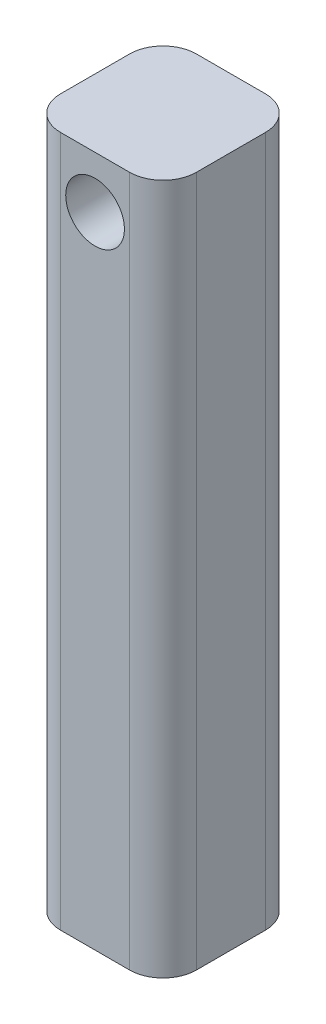
ISO-10303-21;
HEADER;
FILE_DESCRIPTION(('STEP AP214'),'2;1');
FILE_NAME('part.step','',(''),(''),'','','');
FILE_SCHEMA(('AUTOMOTIVE_DESIGN { 1 0 10303 214 1 1 1 1 }'));
ENDSEC;
DATA;
#1=APPLICATION_CONTEXT('core data for automotive mechanical design processes');
#2=APPLICATION_PROTOCOL_DEFINITION('international standard','automotive_design',2000,#1);
#3=PRODUCT_CONTEXT('',#1,'mechanical');
#4=PRODUCT('Part','Part','',(#3));
#5=PRODUCT_RELATED_PRODUCT_CATEGORY('part','',(#4));
#6=PRODUCT_DEFINITION_FORMATION('','',#4);
#7=PRODUCT_DEFINITION_CONTEXT('part definition',#1,'design');
#8=PRODUCT_DEFINITION('design','',#6,#7);
#9=PRODUCT_DEFINITION_SHAPE('','',#8);
#10=(LENGTH_UNIT() NAMED_UNIT(*) SI_UNIT(.MILLI.,.METRE.));
#11=(NAMED_UNIT(*) PLANE_ANGLE_UNIT() SI_UNIT($,.RADIAN.));
#12=(NAMED_UNIT(*) SI_UNIT($,.STERADIAN.) SOLID_ANGLE_UNIT());
#13=UNCERTAINTY_MEASURE_WITH_UNIT(LENGTH_MEASURE(1.E-05),#10,'distance_accuracy_value','');
#14=(GEOMETRIC_REPRESENTATION_CONTEXT(3) GLOBAL_UNCERTAINTY_ASSIGNED_CONTEXT((#13)) GLOBAL_UNIT_ASSIGNED_CONTEXT((#10,
#11,#12)) REPRESENTATION_CONTEXT('',''));
#15=CARTESIAN_POINT('',(0.,0.,0.));
#16=DIRECTION('',(0.,0.,1.));
#17=DIRECTION('',(1.,0.,0.));
#18=AXIS2_PLACEMENT_3D('',#15,#16,#17);
#19=CARTESIAN_POINT('',(-3.,52.,-3.));
#20=DIRECTION('',(0.,-1.,0.));
#21=DIRECTION('',(0.,0.,-1.));
#22=AXIS2_PLACEMENT_3D('',#19,#20,#21);
#23=CYLINDRICAL_SURFACE('',#22,2.9);
#24=CARTESIAN_POINT('',(-3.,4.525,-3.));
#25=DIRECTION('',(0.,-1.,0.));
#26=DIRECTION('',(0.,0.,-1.));
#27=AXIS2_PLACEMENT_3D('',#24,#25,#26);
#28=CIRCLE('',#27,2.9);
#29=CARTESIAN_POINT('',(-5.9,4.525,-3.));
#30=VERTEX_POINT('',#29);
#31=CARTESIAN_POINT('',(-5.31246621596944,4.525,-4.75));
#32=VERTEX_POINT('',#31);
#33=EDGE_CURVE('E161',#30,#32,#28,.T.);
#34=ORIENTED_EDGE('',*,*,#33,.F.);
#35=DIRECTION('',(0.,-1.,0.));
#36=VECTOR('',#35,1.);
#37=CARTESIAN_POINT('',(-5.9,52.,-3.));
#38=LINE('',#37,#36);
#39=CARTESIAN_POINT('',(-5.9,60.,-3.));
#40=VERTEX_POINT('',#39);
#41=EDGE_CURVE('E268',#40,#30,#38,.T.);
#42=ORIENTED_EDGE('',*,*,#41,.F.);
#43=CARTESIAN_POINT('',(-3.,60.,-3.));
#44=DIRECTION('',(0.,1.,0.));
#45=DIRECTION('',(0.,0.,1.));
#46=AXIS2_PLACEMENT_3D('',#43,#44,#45);
#47=CIRCLE('',#46,2.9);
#48=CARTESIAN_POINT('',(-3.,60.,-5.9));
#49=VERTEX_POINT('',#48);
#50=EDGE_CURVE('E223',#49,#40,#47,.T.);
#51=ORIENTED_EDGE('',*,*,#50,.F.);
#52=DIRECTION('',(0.,-1.,0.));
#53=VECTOR('',#52,1.);
#54=CARTESIAN_POINT('',(-3.,52.,-5.9));
#55=LINE('',#54,#53);
#56=CARTESIAN_POINT('',(-3.,0.,-5.9));
#57=VERTEX_POINT('',#56);
#58=EDGE_CURVE('E271',#49,#57,#55,.T.);
#59=ORIENTED_EDGE('',*,*,#58,.T.);
#60=CARTESIAN_POINT('',(-3.,0.,-3.));
#61=DIRECTION('',(0.,1.,0.));
#62=DIRECTION('',(0.,0.,-1.));
#63=AXIS2_PLACEMENT_3D('',#60,#61,#62);
#64=CIRCLE('',#63,2.9);
#65=CARTESIAN_POINT('',(-5.9,0.,-3.));
#66=VERTEX_POINT('',#65);
#67=EDGE_CURVE('E250',#57,#66,#64,.T.);
#68=ORIENTED_EDGE('',*,*,#67,.T.);
#69=CARTESIAN_POINT('',(-5.9,1.475,-3.));
#70=VERTEX_POINT('',#69);
#71=EDGE_CURVE('E267',#70,#66,#38,.T.);
#72=ORIENTED_EDGE('',*,*,#71,.F.);
#73=CARTESIAN_POINT('',(-3.,1.475,-3.));
#74=DIRECTION('',(0.,-1.,0.));
#75=DIRECTION('',(0.,0.,-1.));
#76=AXIS2_PLACEMENT_3D('',#73,#74,#75);
#77=CIRCLE('',#76,2.9);
#78=CARTESIAN_POINT('',(-5.31246621596944,1.475,-4.75));
#79=VERTEX_POINT('',#78);
#80=EDGE_CURVE('E202',#70,#79,#77,.T.);
#81=ORIENTED_EDGE('',*,*,#80,.T.);
#82=DIRECTION('',(0.,-1.,0.));
#83=VECTOR('',#82,1.);
#84=CARTESIAN_POINT('',(-5.31246621596944,52.,-4.75));
#85=LINE('',#84,#83);
#86=EDGE_CURVE('E13',#79,#32,#85,.F.);
#87=ORIENTED_EDGE('',*,*,#86,.T.);
#88=EDGE_LOOP('',(#34,#42,#51,#59,#68,#72,#81,#87));
#89=FACE_BOUND('',#88,.T.);
#90=ADVANCED_FACE('F46',(#89),#23,.T.);
#91=CARTESIAN_POINT('',(-5.9,52.,3.));
#92=DIRECTION('',(1.,0.,0.));
#93=DIRECTION('',(0.,0.,-1.));
#94=AXIS2_PLACEMENT_3D('',#91,#92,#93);
#95=PLANE('',#94);
#96=DIRECTION('',(0.,0.,-1.));
#97=VECTOR('',#96,1.);
#98=CARTESIAN_POINT('',(-5.9,4.525,3.));
#99=LINE('',#98,#97);
#100=CARTESIAN_POINT('',(-5.9,4.525,3.));
#101=VERTEX_POINT('',#100);
#102=EDGE_CURVE('E208',#101,#30,#99,.T.);
#103=ORIENTED_EDGE('',*,*,#102,.F.);
#104=DIRECTION('',(0.,-1.,0.));
#105=VECTOR('',#104,1.);
#106=CARTESIAN_POINT('',(-5.9,52.,3.));
#107=LINE('',#106,#105);
#108=CARTESIAN_POINT('',(-5.9,60.,3.));
#109=VERTEX_POINT('',#108);
#110=EDGE_CURVE('E264',#109,#101,#107,.T.);
#111=ORIENTED_EDGE('',*,*,#110,.F.);
#112=DIRECTION('',(0.,0.,1.));
#113=VECTOR('',#112,1.);
#114=CARTESIAN_POINT('',(-5.9,60.,-3.));
#115=LINE('',#114,#113);
#116=EDGE_CURVE('E226',#40,#109,#115,.T.);
#117=ORIENTED_EDGE('',*,*,#116,.F.);
#118=ORIENTED_EDGE('',*,*,#41,.T.);
#119=EDGE_LOOP('',(#103,#111,#117,#118));
#120=FACE_BOUND('',#119,.T.);
#121=ADVANCED_FACE('F321',(#120),#95,.F.);
#122=CARTESIAN_POINT('',(-3.,52.,3.));
#123=DIRECTION('',(0.,-1.,0.));
#124=DIRECTION('',(0.,0.,-1.));
#125=AXIS2_PLACEMENT_3D('',#122,#123,#124);
#126=CYLINDRICAL_SURFACE('',#125,2.9);
#127=CARTESIAN_POINT('',(-3.,4.525,3.));
#128=DIRECTION('',(0.,-1.,0.));
#129=DIRECTION('',(0.,0.,-1.));
#130=AXIS2_PLACEMENT_3D('',#127,#128,#129);
#131=CIRCLE('',#130,2.9);
#132=CARTESIAN_POINT('',(-5.31246621596944,4.525,4.75));
#133=VERTEX_POINT('',#132);
#134=EDGE_CURVE('E206',#133,#101,#131,.T.);
#135=ORIENTED_EDGE('',*,*,#134,.F.);
#136=DIRECTION('',(0.,-1.,0.));
#137=VECTOR('',#136,1.);
#138=CARTESIAN_POINT('',(-5.31246621596944,52.,4.75));
#139=LINE('',#138,#137);
#140=CARTESIAN_POINT('',(-5.31246621596944,1.475,4.75));
#141=VERTEX_POINT('',#140);
#142=EDGE_CURVE('E54',#133,#141,#139,.T.);
#143=ORIENTED_EDGE('',*,*,#142,.T.);
#144=CARTESIAN_POINT('',(-3.,1.475,3.));
#145=DIRECTION('',(0.,-1.,0.));
#146=DIRECTION('',(0.,0.,-1.));
#147=AXIS2_PLACEMENT_3D('',#144,#145,#146);
#148=CIRCLE('',#147,2.9);
#149=CARTESIAN_POINT('',(-5.9,1.47500000000001,3.));
#150=VERTEX_POINT('',#149);
#151=EDGE_CURVE('E199',#141,#150,#148,.T.);
#152=ORIENTED_EDGE('',*,*,#151,.T.);
#153=CARTESIAN_POINT('',(-5.9,0.,3.));
#154=VERTEX_POINT('',#153);
#155=EDGE_CURVE('E263',#150,#154,#107,.T.);
#156=ORIENTED_EDGE('',*,*,#155,.T.);
#157=CARTESIAN_POINT('',(-3.,0.,3.));
#158=DIRECTION('',(0.,1.,0.));
#159=DIRECTION('',(0.,0.,-1.));
#160=AXIS2_PLACEMENT_3D('',#157,#158,#159);
#161=CIRCLE('',#160,2.9);
#162=CARTESIAN_POINT('',(-3.,0.,5.9));
#163=VERTEX_POINT('',#162);
#164=EDGE_CURVE('E256',#154,#163,#161,.T.);
#165=ORIENTED_EDGE('',*,*,#164,.T.);
#166=DIRECTION('',(0.,-1.,0.));
#167=VECTOR('',#166,1.);
#168=CARTESIAN_POINT('',(-3.,52.,5.9));
#169=LINE('',#168,#167);
#170=CARTESIAN_POINT('',(-3.,60.,5.9));
#171=VERTEX_POINT('',#170);
#172=EDGE_CURVE('E261',#171,#163,#169,.T.);
#173=ORIENTED_EDGE('',*,*,#172,.F.);
#174=CARTESIAN_POINT('',(-3.,60.,3.));
#175=DIRECTION('',(0.,1.,0.));
#176=DIRECTION('',(0.,0.,1.));
#177=AXIS2_PLACEMENT_3D('',#174,#175,#176);
#178=CIRCLE('',#177,2.9);
#179=EDGE_CURVE('E229',#109,#171,#178,.T.);
#180=ORIENTED_EDGE('',*,*,#179,.F.);
#181=ORIENTED_EDGE('',*,*,#110,.T.);
#182=EDGE_LOOP('',(#135,#143,#152,#156,#165,#173,#180,#181));
#183=FACE_BOUND('',#182,.T.);
#184=ADVANCED_FACE('F289',(#183),#126,.T.);
#185=CARTESIAN_POINT('',(3.,0.,3.));
#186=DIRECTION('',(0.,1.,0.));
#187=DIRECTION('',(0.,0.,1.));
#188=AXIS2_PLACEMENT_3D('',#185,#186,#187);
#189=PLANE('',#188);
#190=CARTESIAN_POINT('',(3.,0.,3.));
#191=DIRECTION('',(0.,1.,0.));
#192=DIRECTION('',(0.,0.,1.));
#193=AXIS2_PLACEMENT_3D('',#190,#191,#192);
#194=CIRCLE('',#193,2.9);
#195=CARTESIAN_POINT('',(3.,0.,5.9));
#196=VERTEX_POINT('',#195);
#197=CARTESIAN_POINT('',(5.9,0.,3.));
#198=VERTEX_POINT('',#197);
#199=EDGE_CURVE('E241',#196,#198,#194,.T.);
#200=ORIENTED_EDGE('',*,*,#199,.F.);
#201=DIRECTION('',(1.,0.,0.));
#202=VECTOR('',#201,1.);
#203=CARTESIAN_POINT('',(-3.,0.,5.9));
#204=LINE('',#203,#202);
#205=EDGE_CURVE('E69',#163,#196,#204,.T.);
#206=ORIENTED_EDGE('',*,*,#205,.F.);
#207=ORIENTED_EDGE('',*,*,#164,.F.);
#208=DIRECTION('',(0.,0.,1.));
#209=VECTOR('',#208,1.);
#210=CARTESIAN_POINT('',(-5.9,0.,3.));
#211=LINE('',#210,#209);
#212=EDGE_CURVE('E253',#66,#154,#211,.T.);
#213=ORIENTED_EDGE('',*,*,#212,.F.);
#214=ORIENTED_EDGE('',*,*,#67,.F.);
#215=DIRECTION('',(-1.,0.,0.));
#216=VECTOR('',#215,1.);
#217=CARTESIAN_POINT('',(-3.,0.,-5.9));
#218=LINE('',#217,#216);
#219=CARTESIAN_POINT('',(3.,0.,-5.9));
#220=VERTEX_POINT('',#219);
#221=EDGE_CURVE('E248',#220,#57,#218,.T.);
#222=ORIENTED_EDGE('',*,*,#221,.F.);
#223=CARTESIAN_POINT('',(3.,0.,-3.));
#224=DIRECTION('',(0.,1.,0.));
#225=DIRECTION('',(0.,0.,-1.));
#226=AXIS2_PLACEMENT_3D('',#223,#224,#225);
#227=CIRCLE('',#226,2.9);
#228=CARTESIAN_POINT('',(5.9,0.,-3.));
#229=VERTEX_POINT('',#228);
#230=EDGE_CURVE('E246',#229,#220,#227,.T.);
#231=ORIENTED_EDGE('',*,*,#230,.F.);
#232=DIRECTION('',(0.,0.,-1.));
#233=VECTOR('',#232,1.);
#234=CARTESIAN_POINT('',(5.9,0.,3.));
#235=LINE('',#234,#233);
#236=EDGE_CURVE('E244',#198,#229,#235,.T.);
#237=ORIENTED_EDGE('',*,*,#236,.F.);
#238=EDGE_LOOP('',(#200,#206,#207,#213,#214,#222,#231,#237));
#239=FACE_BOUND('',#238,.T.);
#240=CARTESIAN_POINT('',(0.,0.,0.));
#241=DIRECTION('',(0.,1.,0.));
#242=DIRECTION('',(0.,0.,1.));
#243=AXIS2_PLACEMENT_3D('',#240,#241,#242);
#244=CIRCLE('',#243,2.55);
#245=CARTESIAN_POINT('',(0.,0.,-2.55));
#246=VERTEX_POINT('',#245);
#247=EDGE_CURVE('E238',#246,#246,#244,.T.);
#248=ORIENTED_EDGE('',*,*,#247,.T.);
#249=EDGE_LOOP('',(#248));
#250=FACE_BOUND('',#249,.T.);
#251=ADVANCED_FACE('F311',(#239,#250),#189,.F.);
#252=CARTESIAN_POINT('',(3.,52.,3.));
#253=DIRECTION('',(0.,-1.,0.));
#254=DIRECTION('',(0.,0.,-1.));
#255=AXIS2_PLACEMENT_3D('',#252,#253,#254);
#256=CYLINDRICAL_SURFACE('',#255,2.9);
#257=ORIENTED_EDGE('',*,*,#199,.T.);
#258=DIRECTION('',(0.,-1.,0.));
#259=VECTOR('',#258,1.);
#260=CARTESIAN_POINT('',(5.9,52.,3.));
#261=LINE('',#260,#259);
#262=CARTESIAN_POINT('',(5.9,60.,3.));
#263=VERTEX_POINT('',#262);
#264=EDGE_CURVE('E280',#263,#198,#261,.T.);
#265=ORIENTED_EDGE('',*,*,#264,.F.);
#266=CARTESIAN_POINT('',(3.,60.,3.));
#267=DIRECTION('',(0.,1.,0.));
#268=DIRECTION('',(0.,0.,1.));
#269=AXIS2_PLACEMENT_3D('',#266,#267,#268);
#270=CIRCLE('',#269,2.9);
#271=CARTESIAN_POINT('',(3.,60.,5.9));
#272=VERTEX_POINT('',#271);
#273=EDGE_CURVE('E211',#272,#263,#270,.T.);
#274=ORIENTED_EDGE('',*,*,#273,.F.);
#275=DIRECTION('',(0.,-1.,0.));
#276=VECTOR('',#275,1.);
#277=CARTESIAN_POINT('',(3.,52.,5.9));
#278=LINE('',#277,#276);
#279=EDGE_CURVE('E259',#272,#196,#278,.T.);
#280=ORIENTED_EDGE('',*,*,#279,.T.);
#281=EDGE_LOOP('',(#257,#265,#274,#280));
#282=FACE_BOUND('',#281,.T.);
#283=ADVANCED_FACE('F48',(#282),#256,.T.);
#284=CARTESIAN_POINT('',(5.9,52.,3.));
#285=DIRECTION('',(-1.,0.,0.));
#286=DIRECTION('',(0.,0.,1.));
#287=AXIS2_PLACEMENT_3D('',#284,#285,#286);
#288=PLANE('',#287);
#289=ORIENTED_EDGE('',*,*,#236,.T.);
#290=DIRECTION('',(0.,-1.,0.));
#291=VECTOR('',#290,1.);
#292=CARTESIAN_POINT('',(5.9,52.,-3.));
#293=LINE('',#292,#291);
#294=CARTESIAN_POINT('',(5.9,60.,-3.));
#295=VERTEX_POINT('',#294);
#296=EDGE_CURVE('E277',#295,#229,#293,.T.);
#297=ORIENTED_EDGE('',*,*,#296,.F.);
#298=DIRECTION('',(0.,0.,-1.));
#299=VECTOR('',#298,1.);
#300=CARTESIAN_POINT('',(5.9,60.,3.));
#301=LINE('',#300,#299);
#302=EDGE_CURVE('E214',#263,#295,#301,.T.);
#303=ORIENTED_EDGE('',*,*,#302,.F.);
#304=ORIENTED_EDGE('',*,*,#264,.T.);
#305=EDGE_LOOP('',(#289,#297,#303,#304));
#306=FACE_BOUND('',#305,.T.);
#307=ADVANCED_FACE('F331',(#306),#288,.F.);
#308=CARTESIAN_POINT('',(3.,52.,-3.));
#309=DIRECTION('',(0.,-1.,0.));
#310=DIRECTION('',(0.,0.,-1.));
#311=AXIS2_PLACEMENT_3D('',#308,#309,#310);
#312=CYLINDRICAL_SURFACE('',#311,2.9);
#313=ORIENTED_EDGE('',*,*,#230,.T.);
#314=DIRECTION('',(0.,-1.,0.));
#315=VECTOR('',#314,1.);
#316=CARTESIAN_POINT('',(3.,52.,-5.9));
#317=LINE('',#316,#315);
#318=CARTESIAN_POINT('',(3.,60.,-5.9));
#319=VERTEX_POINT('',#318);
#320=EDGE_CURVE('E274',#319,#220,#317,.T.);
#321=ORIENTED_EDGE('',*,*,#320,.F.);
#322=CARTESIAN_POINT('',(3.,60.,-3.));
#323=DIRECTION('',(0.,1.,0.));
#324=DIRECTION('',(0.,0.,1.));
#325=AXIS2_PLACEMENT_3D('',#322,#323,#324);
#326=CIRCLE('',#325,2.9);
#327=EDGE_CURVE('E217',#295,#319,#326,.T.);
#328=ORIENTED_EDGE('',*,*,#327,.F.);
#329=ORIENTED_EDGE('',*,*,#296,.T.);
#330=EDGE_LOOP('',(#313,#321,#328,#329));
#331=FACE_BOUND('',#330,.T.);
#332=ADVANCED_FACE('F329',(#331),#312,.T.);
#333=CARTESIAN_POINT('',(-3.,52.,-5.9));
#334=DIRECTION('',(0.,0.,1.));
#335=DIRECTION('',(1.,0.,0.));
#336=AXIS2_PLACEMENT_3D('',#333,#334,#335);
#337=PLANE('',#336);
#338=CARTESIAN_POINT('',(0.,55.5,-5.9));
#339=DIRECTION('',(0.,0.,-1.));
#340=DIRECTION('',(-1.,0.,0.));
#341=AXIS2_PLACEMENT_3D('',#338,#339,#340);
#342=CIRCLE('',#341,2.55000000000001);
#343=CARTESIAN_POINT('',(-2.55000000000001,55.5,-5.9));
#344=VERTEX_POINT('',#343);
#345=EDGE_CURVE('E353',#344,#344,#342,.T.);
#346=ORIENTED_EDGE('',*,*,#345,.F.);
#347=EDGE_LOOP('',(#346));
#348=FACE_BOUND('',#347,.T.);
#349=ORIENTED_EDGE('',*,*,#221,.T.);
#350=ORIENTED_EDGE('',*,*,#58,.F.);
#351=DIRECTION('',(-1.,0.,0.));
#352=VECTOR('',#351,1.);
#353=CARTESIAN_POINT('',(3.,60.,-5.9));
#354=LINE('',#353,#352);
#355=EDGE_CURVE('E220',#319,#49,#354,.T.);
#356=ORIENTED_EDGE('',*,*,#355,.F.);
#357=ORIENTED_EDGE('',*,*,#320,.T.);
#358=EDGE_LOOP('',(#349,#350,#356,#357));
#359=FACE_BOUND('',#358,.T.);
#360=ADVANCED_FACE('F326',(#348,#359),#337,.F.);
#361=ORIENTED_EDGE('',*,*,#155,.F.);
#362=DIRECTION('',(0.,0.,-1.));
#363=VECTOR('',#362,1.);
#364=CARTESIAN_POINT('',(-5.9,1.475,3.));
#365=LINE('',#364,#363);
#366=EDGE_CURVE('E61',#150,#70,#365,.T.);
#367=ORIENTED_EDGE('',*,*,#366,.T.);
#368=ORIENTED_EDGE('',*,*,#71,.T.);
#369=ORIENTED_EDGE('',*,*,#212,.T.);
#370=EDGE_LOOP('',(#361,#367,#368,#369));
#371=FACE_BOUND('',#370,.T.);
#372=ADVANCED_FACE('F304',(#371),#95,.F.);
#373=CARTESIAN_POINT('',(-3.,52.,5.9));
#374=DIRECTION('',(0.,0.,-1.));
#375=DIRECTION('',(-1.,0.,0.));
#376=AXIS2_PLACEMENT_3D('',#373,#374,#375);
#377=PLANE('',#376);
#378=CARTESIAN_POINT('',(0.,55.5,5.9));
#379=DIRECTION('',(0.,0.,-1.));
#380=DIRECTION('',(-1.,0.,0.));
#381=AXIS2_PLACEMENT_3D('',#378,#379,#380);
#382=CIRCLE('',#381,2.55000000000001);
#383=CARTESIAN_POINT('',(-2.55000000000001,55.5,5.9));
#384=VERTEX_POINT('',#383);
#385=EDGE_CURVE('E187',#384,#384,#382,.T.);
#386=ORIENTED_EDGE('',*,*,#385,.T.);
#387=EDGE_LOOP('',(#386));
#388=FACE_BOUND('',#387,.T.);
#389=ORIENTED_EDGE('',*,*,#205,.T.);
#390=ORIENTED_EDGE('',*,*,#279,.F.);
#391=DIRECTION('',(1.,0.,0.));
#392=VECTOR('',#391,1.);
#393=CARTESIAN_POINT('',(-3.,60.,5.9));
#394=LINE('',#393,#392);
#395=EDGE_CURVE('E232',#171,#272,#394,.T.);
#396=ORIENTED_EDGE('',*,*,#395,.F.);
#397=ORIENTED_EDGE('',*,*,#172,.T.);
#398=EDGE_LOOP('',(#389,#390,#396,#397));
#399=FACE_BOUND('',#398,.T.);
#400=ADVANCED_FACE('F309',(#388,#399),#377,.F.);
#401=CARTESIAN_POINT('',(0.,52.,0.));
#402=DIRECTION('',(0.,-1.,0.));
#403=DIRECTION('',(0.,0.,-1.));
#404=AXIS2_PLACEMENT_3D('',#401,#402,#403);
#405=CYLINDRICAL_SURFACE('',#404,2.55);
#406=CARTESIAN_POINT('',(0.,1.475,0.));
#407=DIRECTION('',(0.,-1.,0.));
#408=DIRECTION('',(0.,0.,-1.));
#409=AXIS2_PLACEMENT_3D('',#406,#407,#408);
#410=CIRCLE('',#409,2.55);
#411=CARTESIAN_POINT('',(0.,1.475,-2.55));
#412=VERTEX_POINT('',#411);
#413=EDGE_CURVE('E197',#412,#412,#410,.T.);
#414=CARTESIAN_POINT('',(0.,1.475,-2.55));
#415=CARTESIAN_POINT('',(0.,1.45963541666667,-2.55));
#416=CARTESIAN_POINT('',(0.,1.44427083333333,-2.55));
#417=CARTESIAN_POINT('',(0.,1.41354166666667,-2.55));
#418=CARTESIAN_POINT('',(0.,1.39817708333334,-2.55));
#419=CARTESIAN_POINT('',(0.,1.36744791666667,-2.55));
#420=CARTESIAN_POINT('',(0.,1.35208333333334,-2.55));
#421=CARTESIAN_POINT('',(0.,1.32135416666667,-2.55));
#422=CARTESIAN_POINT('',(0.,1.30598958333334,-2.55));
#423=CARTESIAN_POINT('',(0.,1.27526041666667,-2.55));
#424=CARTESIAN_POINT('',(0.,1.25989583333333,-2.55));
#425=CARTESIAN_POINT('',(0.,1.22916666666667,-2.55));
#426=CARTESIAN_POINT('',(0.,1.21380208333334,-2.55));
#427=CARTESIAN_POINT('',(0.,1.18307291666667,-2.55));
#428=CARTESIAN_POINT('',(0.,1.16770833333334,-2.55));
#429=CARTESIAN_POINT('',(0.,1.13697916666667,-2.55));
#430=CARTESIAN_POINT('',(0.,1.12161458333334,-2.55));
#431=CARTESIAN_POINT('',(0.,1.09088541666667,-2.55));
#432=CARTESIAN_POINT('',(0.,1.07552083333333,-2.55));
#433=CARTESIAN_POINT('',(0.,1.04479166666667,-2.55));
#434=CARTESIAN_POINT('',(0.,1.02942708333333,-2.55));
#435=CARTESIAN_POINT('',(0.,0.998697916666671,-2.55));
#436=CARTESIAN_POINT('',(0.,0.983333333333338,-2.55));
#437=CARTESIAN_POINT('',(0.,0.952604166666672,-2.55));
#438=CARTESIAN_POINT('',(0.,0.937239583333337,-2.55));
#439=CARTESIAN_POINT('',(0.,0.906510416666668,-2.55));
#440=CARTESIAN_POINT('',(0.,0.891145833333334,-2.55));
#441=CARTESIAN_POINT('',(0.,0.860416666666667,-2.55));
#442=CARTESIAN_POINT('',(0.,0.845052083333334,-2.55));
#443=CARTESIAN_POINT('',(0.,0.81432291666667,-2.55));
#444=CARTESIAN_POINT('',(0.,0.798958333333338,-2.55));
#445=CARTESIAN_POINT('',(0.,0.768229166666671,-2.55));
#446=CARTESIAN_POINT('',(0.,0.752864583333337,-2.55));
#447=CARTESIAN_POINT('',(0.,0.722135416666667,-2.55));
#448=CARTESIAN_POINT('',(0.,0.706770833333333,-2.55));
#449=CARTESIAN_POINT('',(0.,0.676041666666666,-2.55));
#450=CARTESIAN_POINT('',(0.,0.660677083333334,-2.55));
#451=CARTESIAN_POINT('',(0.,0.62994791666667,-2.55));
#452=CARTESIAN_POINT('',(0.,0.614583333333337,-2.55));
#453=CARTESIAN_POINT('',(0.,0.583854166666671,-2.55));
#454=CARTESIAN_POINT('',(0.,0.568489583333336,-2.55));
#455=CARTESIAN_POINT('',(0.,0.537760416666667,-2.55));
#456=CARTESIAN_POINT('',(0.,0.522395833333333,-2.55));
#457=CARTESIAN_POINT('',(0.,0.491666666666666,-2.55));
#458=CARTESIAN_POINT('',(0.,0.476302083333334,-2.55));
#459=CARTESIAN_POINT('',(0.,0.445572916666669,-2.55));
#460=CARTESIAN_POINT('',(0.,0.430208333333337,-2.55));
#461=CARTESIAN_POINT('',(0.,0.39947916666667,-2.55));
#462=CARTESIAN_POINT('',(0.,0.384114583333336,-2.55));
#463=CARTESIAN_POINT('',(0.,0.353385416666667,-2.55));
#464=CARTESIAN_POINT('',(0.,0.338020833333332,-2.55));
#465=CARTESIAN_POINT('',(0.,0.307291666666665,-2.55));
#466=CARTESIAN_POINT('',(0.,0.291927083333333,-2.55));
#467=CARTESIAN_POINT('',(0.,0.261197916666669,-2.55));
#468=CARTESIAN_POINT('',(0.,0.245833333333336,-2.55));
#469=CARTESIAN_POINT('',(0.,0.21510416666667,-2.55));
#470=CARTESIAN_POINT('',(0.,0.199739583333335,-2.55));
#471=CARTESIAN_POINT('',(0.,0.169010416666666,-2.55));
#472=CARTESIAN_POINT('',(0.,0.153645833333331,-2.55));
#473=CARTESIAN_POINT('',(0.,0.122916666666665,-2.55));
#474=CARTESIAN_POINT('',(0.,0.107552083333332,-2.55));
#475=CARTESIAN_POINT('',(0.,0.076822916666668,-2.55));
#476=CARTESIAN_POINT('',(0.,0.0614583333333358,-2.55));
#477=CARTESIAN_POINT('',(0.,0.0307291666666691,-2.55));
#478=CARTESIAN_POINT('',(0.,0.0153645833333346,-2.55));
#479=CARTESIAN_POINT('',(0.,0.,-2.55));
#480=B_SPLINE_CURVE_WITH_KNOTS('',3,(#414,#415,#416,#417,#418,#419,#420,#421,#422,#423,#424,
#425,#426,#427,#428,#429,#430,#431,#432,#433,#434,#435,#436,#437,#438,#439,#440,#441,#442,#443,
#444,#445,#446,#447,#448,#449,#450,#451,#452,#453,#454,#455,#456,#457,#458,#459,#460,#461,#462,
#463,#464,#465,#466,#467,#468,#469,#470,#471,#472,#473,#474,#475,#476,#477,#478,#479),
.UNSPECIFIED.,.F.,.F.,(4,2,2,2,2,2,2,2,2,2,2,2,2,2,2,2,2,2,2,2,2,2,2,2,2,2,2,2,2,2,2,2,4),(0.,
0.0460937500000036,0.0921875000000003,0.138281249999997,0.184375000000001,0.230468750000004,
0.276562500000001,0.322656249999997,0.368750000000001,0.414843750000005,0.460937500000001,
0.507031249999998,0.553125000000002,0.599218750000005,0.645312500000002,0.691406249999998,
0.737500000000002,0.783593750000006,0.829687500000002,0.875781249999999,0.921875000000003,
0.967968750000006,1.0140625,1.06015625,1.10625,1.15234375000001,1.1984375,1.24453125,1.290625,
1.33671875000001,1.3828125,1.42890625,1.475),.UNSPECIFIED.);
#481=EDGE_CURVE('BSEAM370',#412,#246,#480,.T.);
#482=ORIENTED_EDGE('',*,*,#413,.F.);
#483=ORIENTED_EDGE('',*,*,#247,.F.);
#484=ORIENTED_EDGE('',*,*,#481,.T.);
#485=ORIENTED_EDGE('',*,*,#481,.F.);
#486=EDGE_LOOP('',(#482,#484,#483,#485));
#487=FACE_BOUND('',#486,.T.);
#488=ADVANCED_FACE('F370',(#487),#405,.F.);
#489=CARTESIAN_POINT('',(3.,60.,3.));
#490=DIRECTION('',(0.,1.,0.));
#491=DIRECTION('',(0.,0.,1.));
#492=AXIS2_PLACEMENT_3D('',#489,#490,#491);
#493=PLANE('',#492);
#494=ORIENTED_EDGE('',*,*,#273,.T.);
#495=ORIENTED_EDGE('',*,*,#302,.T.);
#496=ORIENTED_EDGE('',*,*,#327,.T.);
#497=ORIENTED_EDGE('',*,*,#355,.T.);
#498=ORIENTED_EDGE('',*,*,#50,.T.);
#499=ORIENTED_EDGE('',*,*,#116,.T.);
#500=ORIENTED_EDGE('',*,*,#179,.T.);
#501=ORIENTED_EDGE('',*,*,#395,.T.);
#502=EDGE_LOOP('',(#494,#495,#496,#497,#498,#499,#500,#501));
#503=FACE_BOUND('',#502,.T.);
#504=ADVANCED_FACE('F318',(#503),#493,.T.);
#505=CARTESIAN_POINT('',(-2.74241377865072,4.525,-4.75));
#506=DIRECTION('',(0.,0.,-1.));
#507=DIRECTION('',(-1.,0.,0.));
#508=AXIS2_PLACEMENT_3D('',#505,#506,#507);
#509=PLANE('',#508);
#510=DIRECTION('',(1.,0.,0.));
#511=VECTOR('',#510,1.);
#512=CARTESIAN_POINT('',(-2.74241377865072,1.475,-4.75));
#513=LINE('',#512,#511);
#514=CARTESIAN_POINT('',(2.74241377865072,1.475,-4.75));
#515=VERTEX_POINT('',#514);
#516=EDGE_CURVE('E163',#79,#515,#513,.T.);
#517=ORIENTED_EDGE('',*,*,#516,.T.);
#518=DIRECTION('',(0.,-1.,0.));
#519=VECTOR('',#518,1.);
#520=CARTESIAN_POINT('',(2.74241377865072,4.525,-4.75));
#521=LINE('',#520,#519);
#522=CARTESIAN_POINT('',(2.74241377865072,4.525,-4.75));
#523=VERTEX_POINT('',#522);
#524=EDGE_CURVE('E166',#523,#515,#521,.T.);
#525=ORIENTED_EDGE('',*,*,#524,.F.);
#526=DIRECTION('',(1.,0.,0.));
#527=VECTOR('',#526,1.);
#528=CARTESIAN_POINT('',(-2.74241377865072,4.525,-4.75));
#529=LINE('',#528,#527);
#530=EDGE_CURVE('E154',#32,#523,#529,.T.);
#531=ORIENTED_EDGE('',*,*,#530,.F.);
#532=ORIENTED_EDGE('',*,*,#86,.F.);
#533=EDGE_LOOP('',(#517,#525,#531,#532));
#534=FACE_BOUND('',#533,.T.);
#535=ADVANCED_FACE('F167',(#534),#509,.F.);
#536=CARTESIAN_POINT('',(-6.30532333061348,4.525,4.75));
#537=DIRECTION('',(0.,0.,1.));
#538=DIRECTION('',(1.,0.,0.));
#539=AXIS2_PLACEMENT_3D('',#536,#537,#538);
#540=PLANE('',#539);
#541=DIRECTION('',(-1.,0.,0.));
#542=VECTOR('',#541,1.);
#543=CARTESIAN_POINT('',(2.74241377865072,4.525,4.75));
#544=LINE('',#543,#542);
#545=CARTESIAN_POINT('',(2.74241377865072,4.525,4.75));
#546=VERTEX_POINT('',#545);
#547=EDGE_CURVE('E173',#546,#133,#544,.T.);
#548=ORIENTED_EDGE('',*,*,#547,.F.);
#549=DIRECTION('',(0.,-1.,0.));
#550=VECTOR('',#549,1.);
#551=CARTESIAN_POINT('',(2.74241377865072,4.525,4.75));
#552=LINE('',#551,#550);
#553=CARTESIAN_POINT('',(2.74241377865072,1.475,4.75));
#554=VERTEX_POINT('',#553);
#555=EDGE_CURVE('E194',#546,#554,#552,.T.);
#556=ORIENTED_EDGE('',*,*,#555,.T.);
#557=DIRECTION('',(-1.,0.,0.));
#558=VECTOR('',#557,1.);
#559=CARTESIAN_POINT('',(-6.30532333061348,1.475,4.75));
#560=LINE('',#559,#558);
#561=EDGE_CURVE('E190',#554,#141,#560,.T.);
#562=ORIENTED_EDGE('',*,*,#561,.T.);
#563=ORIENTED_EDGE('',*,*,#142,.F.);
#564=EDGE_LOOP('',(#548,#556,#562,#563));
#565=FACE_BOUND('',#564,.T.);
#566=ADVANCED_FACE('F293',(#565),#540,.F.);
#567=CARTESIAN_POINT('',(0.,4.525,0.));
#568=DIRECTION('',(0.,-1.,0.));
#569=DIRECTION('',(0.,0.,-1.));
#570=AXIS2_PLACEMENT_3D('',#567,#568,#569);
#571=PLANE('',#570);
#572=CARTESIAN_POINT('',(0.,4.525,0.));
#573=DIRECTION('',(0.,-1.,0.));
#574=DIRECTION('',(0.,0.,-1.));
#575=AXIS2_PLACEMENT_3D('',#572,#573,#574);
#576=CIRCLE('',#575,2.55);
#577=CARTESIAN_POINT('',(0.,4.525,-2.55));
#578=VERTEX_POINT('',#577);
#579=EDGE_CURVE('E205',#578,#578,#576,.T.);
#580=ORIENTED_EDGE('',*,*,#579,.F.);
#581=EDGE_LOOP('',(#580));
#582=FACE_BOUND('',#581,.T.);
#583=ORIENTED_EDGE('',*,*,#33,.T.);
#584=ORIENTED_EDGE('',*,*,#530,.T.);
#585=DIRECTION('',(0.5,0.,0.866025403784439));
#586=VECTOR('',#585,1.);
#587=CARTESIAN_POINT('',(2.74241377865072,4.525,-4.75));
#588=LINE('',#587,#586);
#589=CARTESIAN_POINT('',(5.48482755730144,4.525,0.));
#590=VERTEX_POINT('',#589);
#591=EDGE_CURVE('E159',#523,#590,#588,.T.);
#592=ORIENTED_EDGE('',*,*,#591,.T.);
#593=DIRECTION('',(-0.5,0.,0.866025403784439));
#594=VECTOR('',#593,1.);
#595=CARTESIAN_POINT('',(5.48482755730144,4.525,0.));
#596=LINE('',#595,#594);
#597=EDGE_CURVE('E177',#590,#546,#596,.T.);
#598=ORIENTED_EDGE('',*,*,#597,.T.);
#599=ORIENTED_EDGE('',*,*,#547,.T.);
#600=ORIENTED_EDGE('',*,*,#134,.T.);
#601=ORIENTED_EDGE('',*,*,#102,.T.);
#602=EDGE_LOOP('',(#583,#584,#592,#598,#599,#600,#601));
#603=FACE_BOUND('',#602,.T.);
#604=ADVANCED_FACE('F156',(#582,#603),#571,.T.);
#605=CARTESIAN_POINT('',(0.,1.475,0.));
#606=DIRECTION('',(0.,-1.,0.));
#607=DIRECTION('',(0.,0.,-1.));
#608=AXIS2_PLACEMENT_3D('',#605,#606,#607);
#609=PLANE('',#608);
#610=ORIENTED_EDGE('',*,*,#413,.T.);
#611=EDGE_LOOP('',(#610));
#612=FACE_BOUND('',#611,.T.);
#613=ORIENTED_EDGE('',*,*,#366,.F.);
#614=ORIENTED_EDGE('',*,*,#151,.F.);
#615=ORIENTED_EDGE('',*,*,#561,.F.);
#616=DIRECTION('',(-0.5,0.,0.866025403784439));
#617=VECTOR('',#616,1.);
#618=CARTESIAN_POINT('',(5.48482755730144,1.475,0.));
#619=LINE('',#618,#617);
#620=CARTESIAN_POINT('',(5.48482755730144,1.475,0.));
#621=VERTEX_POINT('',#620);
#622=EDGE_CURVE('E186',#621,#554,#619,.T.);
#623=ORIENTED_EDGE('',*,*,#622,.F.);
#624=DIRECTION('',(0.5,0.,0.866025403784439));
#625=VECTOR('',#624,1.);
#626=CARTESIAN_POINT('',(2.74241377865072,1.475,-4.75));
#627=LINE('',#626,#625);
#628=EDGE_CURVE('E184',#515,#621,#627,.T.);
#629=ORIENTED_EDGE('',*,*,#628,.F.);
#630=ORIENTED_EDGE('',*,*,#516,.F.);
#631=ORIENTED_EDGE('',*,*,#80,.F.);
#632=EDGE_LOOP('',(#613,#614,#615,#623,#629,#630,#631));
#633=FACE_BOUND('',#632,.T.);
#634=ADVANCED_FACE('F298',(#612,#633),#609,.F.);
#635=CARTESIAN_POINT('',(5.48482755730144,4.525,0.));
#636=DIRECTION('',(0.866025403784439,0.,0.5));
#637=DIRECTION('',(0.5,0.,-0.866025403784439));
#638=AXIS2_PLACEMENT_3D('',#635,#636,#637);
#639=PLANE('',#638);
#640=ORIENTED_EDGE('',*,*,#622,.T.);
#641=ORIENTED_EDGE('',*,*,#555,.F.);
#642=ORIENTED_EDGE('',*,*,#597,.F.);
#643=DIRECTION('',(0.,-1.,0.));
#644=VECTOR('',#643,1.);
#645=CARTESIAN_POINT('',(5.48482755730144,4.525,0.));
#646=LINE('',#645,#644);
#647=EDGE_CURVE('E172',#590,#621,#646,.T.);
#648=ORIENTED_EDGE('',*,*,#647,.T.);
#649=EDGE_LOOP('',(#640,#641,#642,#648));
#650=FACE_BOUND('',#649,.T.);
#651=ADVANCED_FACE('F296',(#650),#639,.F.);
#652=CARTESIAN_POINT('',(2.74241377865072,4.525,-4.75));
#653=DIRECTION('',(0.866025403784439,0.,-0.5));
#654=DIRECTION('',(-0.5,0.,-0.866025403784439));
#655=AXIS2_PLACEMENT_3D('',#652,#653,#654);
#656=PLANE('',#655);
#657=ORIENTED_EDGE('',*,*,#628,.T.);
#658=ORIENTED_EDGE('',*,*,#647,.F.);
#659=ORIENTED_EDGE('',*,*,#591,.F.);
#660=ORIENTED_EDGE('',*,*,#524,.T.);
#661=EDGE_LOOP('',(#657,#658,#659,#660));
#662=FACE_BOUND('',#661,.T.);
#663=ADVANCED_FACE('F175',(#662),#656,.F.);
#664=CARTESIAN_POINT('',(3.,52.,3.));
#665=DIRECTION('',(0.,1.,0.));
#666=DIRECTION('',(0.,0.,1.));
#667=AXIS2_PLACEMENT_3D('',#664,#665,#666);
#668=PLANE('',#667);
#669=CARTESIAN_POINT('',(0.,52.,0.));
#670=DIRECTION('',(0.,1.,0.));
#671=DIRECTION('',(0.,0.,1.));
#672=AXIS2_PLACEMENT_3D('',#669,#670,#671);
#673=CIRCLE('',#672,2.55);
#674=CARTESIAN_POINT('',(0.,52.,-2.55));
#675=VERTEX_POINT('',#674);
#676=EDGE_CURVE('E235',#675,#675,#673,.T.);
#677=ORIENTED_EDGE('',*,*,#676,.F.);
#678=EDGE_LOOP('',(#677));
#679=FACE_BOUND('',#678,.T.);
#680=ADVANCED_FACE('F367',(#679),#668,.F.);
#681=CARTESIAN_POINT('',(0.,52.,-2.55));
#682=CARTESIAN_POINT('',(0.,51.50546875,-2.55));
#683=CARTESIAN_POINT('',(0.,51.0109375,-2.55));
#684=CARTESIAN_POINT('',(0.,50.021875,-2.55));
#685=CARTESIAN_POINT('',(0.,49.52734375,-2.55));
#686=CARTESIAN_POINT('',(0.,48.53828125,-2.55));
#687=CARTESIAN_POINT('',(0.,48.04375,-2.55));
#688=CARTESIAN_POINT('',(0.,47.0546875,-2.55));
#689=CARTESIAN_POINT('',(0.,46.56015625,-2.55));
#690=CARTESIAN_POINT('',(0.,45.57109375,-2.55));
#691=CARTESIAN_POINT('',(0.,45.0765625,-2.55));
#692=CARTESIAN_POINT('',(0.,44.0875,-2.55));
#693=CARTESIAN_POINT('',(0.,43.59296875,-2.55));
#694=CARTESIAN_POINT('',(0.,42.60390625,-2.55));
#695=CARTESIAN_POINT('',(0.,42.109375,-2.55));
#696=CARTESIAN_POINT('',(0.,41.1203125,-2.55));
#697=CARTESIAN_POINT('',(0.,40.62578125,-2.55));
#698=CARTESIAN_POINT('',(0.,39.63671875,-2.55));
#699=CARTESIAN_POINT('',(0.,39.1421875,-2.55));
#700=CARTESIAN_POINT('',(0.,38.153125,-2.55));
#701=CARTESIAN_POINT('',(0.,37.65859375,-2.55));
#702=CARTESIAN_POINT('',(0.,36.66953125,-2.55));
#703=CARTESIAN_POINT('',(0.,36.175,-2.55));
#704=CARTESIAN_POINT('',(0.,35.1859375,-2.55));
#705=CARTESIAN_POINT('',(0.,34.69140625,-2.55));
#706=CARTESIAN_POINT('',(0.,33.70234375,-2.55));
#707=CARTESIAN_POINT('',(0.,33.2078125,-2.55));
#708=CARTESIAN_POINT('',(0.,32.21875,-2.55));
#709=CARTESIAN_POINT('',(0.,31.72421875,-2.55));
#710=CARTESIAN_POINT('',(0.,30.73515625,-2.55));
#711=CARTESIAN_POINT('',(0.,30.240625,-2.55));
#712=CARTESIAN_POINT('',(0.,29.2515625,-2.55));
#713=CARTESIAN_POINT('',(0.,28.75703125,-2.55));
#714=CARTESIAN_POINT('',(0.,27.76796875,-2.55));
#715=CARTESIAN_POINT('',(0.,27.2734375,-2.55));
#716=CARTESIAN_POINT('',(0.,26.284375,-2.55));
#717=CARTESIAN_POINT('',(0.,25.78984375,-2.55));
#718=CARTESIAN_POINT('',(0.,24.80078125,-2.55));
#719=CARTESIAN_POINT('',(0.,24.30625,-2.55));
#720=CARTESIAN_POINT('',(0.,23.3171875,-2.55));
#721=CARTESIAN_POINT('',(0.,22.82265625,-2.55));
#722=CARTESIAN_POINT('',(0.,21.83359375,-2.55));
#723=CARTESIAN_POINT('',(0.,21.3390625,-2.55));
#724=CARTESIAN_POINT('',(0.,20.35,-2.55));
#725=CARTESIAN_POINT('',(0.,19.85546875,-2.55));
#726=CARTESIAN_POINT('',(0.,18.86640625,-2.55));
#727=CARTESIAN_POINT('',(0.,18.371875,-2.55));
#728=CARTESIAN_POINT('',(0.,17.3828125,-2.55));
#729=CARTESIAN_POINT('',(0.,16.88828125,-2.55));
#730=CARTESIAN_POINT('',(0.,15.89921875,-2.55));
#731=CARTESIAN_POINT('',(0.,15.4046875,-2.55));
#732=CARTESIAN_POINT('',(0.,14.415625,-2.55));
#733=CARTESIAN_POINT('',(0.,13.92109375,-2.55));
#734=CARTESIAN_POINT('',(0.,12.93203125,-2.55));
#735=CARTESIAN_POINT('',(0.,12.4375,-2.55));
#736=CARTESIAN_POINT('',(0.,11.4484375,-2.55));
#737=CARTESIAN_POINT('',(0.,10.95390625,-2.55));
#738=CARTESIAN_POINT('',(0.,9.96484375,-2.55));
#739=CARTESIAN_POINT('',(0.,9.4703125,-2.55));
#740=CARTESIAN_POINT('',(0.,8.48125,-2.55));
#741=CARTESIAN_POINT('',(0.,7.98671875,-2.55));
#742=CARTESIAN_POINT('',(0.,6.99765625,-2.55));
#743=CARTESIAN_POINT('',(0.,6.503125,-2.55));
#744=CARTESIAN_POINT('',(0.,5.5140625,-2.55));
#745=CARTESIAN_POINT('',(0.,5.01953125,-2.55));
#746=CARTESIAN_POINT('',(0.,4.525,-2.55));
#747=B_SPLINE_CURVE_WITH_KNOTS('',3,(#681,#682,#683,#684,#685,#686,#687,#688,#689,#690,#691,
#692,#693,#694,#695,#696,#697,#698,#699,#700,#701,#702,#703,#704,#705,#706,#707,#708,#709,#710,
#711,#712,#713,#714,#715,#716,#717,#718,#719,#720,#721,#722,#723,#724,#725,#726,#727,#728,#729,
#730,#731,#732,#733,#734,#735,#736,#737,#738,#739,#740,#741,#742,#743,#744,#745,#746),
.UNSPECIFIED.,.F.,.F.,(4,2,2,2,2,2,2,2,2,2,2,2,2,2,2,2,2,2,2,2,2,2,2,2,2,2,2,2,2,2,2,2,4),(0.,
1.48359375,2.9671875,4.45078124999999,5.93437499999999,7.41796875,8.9015625,10.38515625,
11.86875,13.35234375,14.8359375,16.31953125,17.803125,19.28671875,20.7703125,22.25390625,
23.7375,25.22109375,26.7046875,28.18828125,29.671875,31.15546875,32.6390625,34.12265625,
35.60625,37.08984375,38.5734375,40.05703125,41.540625,43.02421875,44.5078125,45.99140625,
47.475),.UNSPECIFIED.);
#748=EDGE_CURVE('BSEAM362',#675,#578,#747,.T.);
#749=ORIENTED_EDGE('',*,*,#676,.T.);
#750=ORIENTED_EDGE('',*,*,#579,.T.);
#751=ORIENTED_EDGE('',*,*,#748,.T.);
#752=ORIENTED_EDGE('',*,*,#748,.F.);
#753=EDGE_LOOP('',(#749,#751,#750,#752));
#754=FACE_BOUND('',#753,.T.);
#755=ADVANCED_FACE('F362',(#754),#405,.F.);
#756=CARTESIAN_POINT('',(0.,55.5,5.9));
#757=DIRECTION('',(0.,0.,-1.));
#758=DIRECTION('',(-1.,0.,0.));
#759=AXIS2_PLACEMENT_3D('',#756,#757,#758);
#760=CYLINDRICAL_SURFACE('',#759,2.55000000000001);
#761=ORIENTED_EDGE('',*,*,#385,.F.);
#762=EDGE_LOOP('',(#761));
#763=FACE_BOUND('',#762,.T.);
#764=ORIENTED_EDGE('',*,*,#345,.T.);
#765=EDGE_LOOP('',(#764));
#766=FACE_BOUND('',#765,.T.);
#767=ADVANCED_FACE('F360',(#763,#766),#760,.F.);
#768=CLOSED_SHELL('',(#90,#121,#184,#251,#283,#307,#332,#360,#372,#400,#488,#504,#535,#566,#604,
#634,#651,#663,#680,#755,#767));
#769=MANIFOLD_SOLID_BREP('B2',#768);
#770=ADVANCED_BREP_SHAPE_REPRESENTATION('',(#18,#769),#14);
#771=SHAPE_DEFINITION_REPRESENTATION(#9,#770);
ENDSEC;
END-ISO-10303-21;
